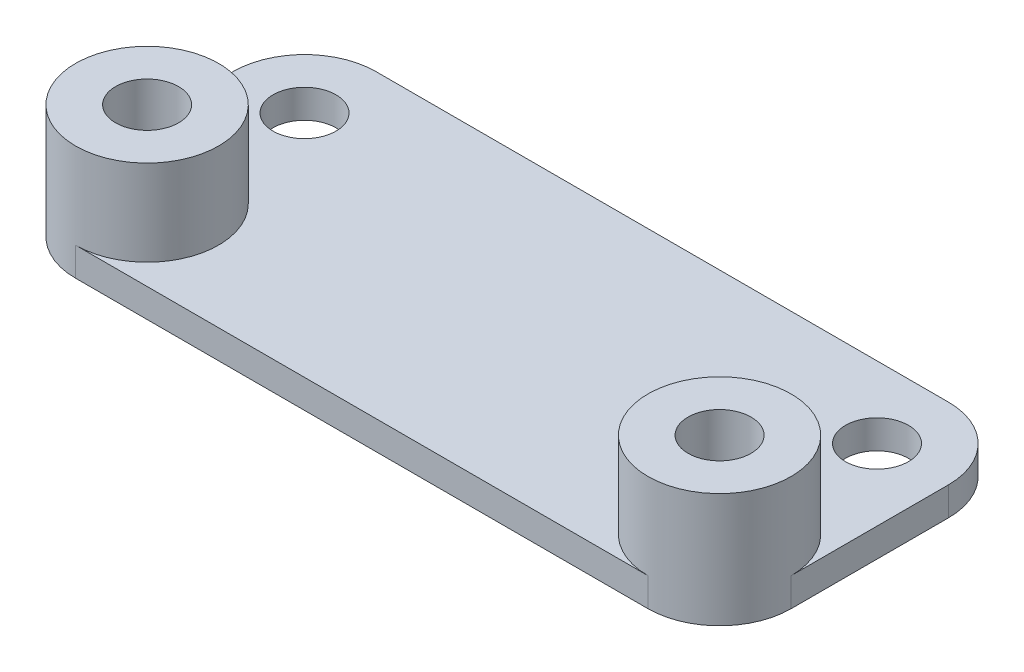
ISO-10303-21;
HEADER;
FILE_DESCRIPTION(('STEP AP214'),'2;1');
FILE_NAME('part.step','',(''),(''),'','','');
FILE_SCHEMA(('AUTOMOTIVE_DESIGN { 1 0 10303 214 1 1 1 1 }'));
ENDSEC;
DATA;
#1=APPLICATION_CONTEXT('core data for automotive mechanical design processes');
#2=APPLICATION_PROTOCOL_DEFINITION('international standard','automotive_design',2000,#1);
#3=PRODUCT_CONTEXT('',#1,'mechanical');
#4=PRODUCT('Part','Part','',(#3));
#5=PRODUCT_RELATED_PRODUCT_CATEGORY('part','',(#4));
#6=PRODUCT_DEFINITION_FORMATION('','',#4);
#7=PRODUCT_DEFINITION_CONTEXT('part definition',#1,'design');
#8=PRODUCT_DEFINITION('design','',#6,#7);
#9=PRODUCT_DEFINITION_SHAPE('','',#8);
#10=(LENGTH_UNIT() NAMED_UNIT(*) SI_UNIT(.MILLI.,.METRE.));
#11=(NAMED_UNIT(*) PLANE_ANGLE_UNIT() SI_UNIT($,.RADIAN.));
#12=(NAMED_UNIT(*) SI_UNIT($,.STERADIAN.) SOLID_ANGLE_UNIT());
#13=UNCERTAINTY_MEASURE_WITH_UNIT(LENGTH_MEASURE(1.E-05),#10,'distance_accuracy_value','');
#14=(GEOMETRIC_REPRESENTATION_CONTEXT(3) GLOBAL_UNCERTAINTY_ASSIGNED_CONTEXT((#13)) GLOBAL_UNIT_ASSIGNED_CONTEXT((#10,
#11,#12)) REPRESENTATION_CONTEXT('',''));
#15=CARTESIAN_POINT('',(0.,0.,0.));
#16=DIRECTION('',(0.,0.,1.));
#17=DIRECTION('',(1.,0.,0.));
#18=AXIS2_PLACEMENT_3D('',#15,#16,#17);
#19=CARTESIAN_POINT('',(-20.,2.,3.5));
#20=DIRECTION('',(0.,-1.,0.));
#21=DIRECTION('',(0.,0.,-1.));
#22=AXIS2_PLACEMENT_3D('',#19,#20,#21);
#23=PLANE('',#22);
#24=CARTESIAN_POINT('',(20.,2.,-7.5));
#25=DIRECTION('',(0.,1.,0.));
#26=DIRECTION('',(0.,0.,1.));
#27=AXIS2_PLACEMENT_3D('',#24,#25,#26);
#28=CIRCLE('',#27,2.2);
#29=CARTESIAN_POINT('',(20.,2.,-5.29999999999999));
#30=VERTEX_POINT('',#29);
#31=EDGE_CURVE('E147',#30,#30,#28,.T.);
#32=ORIENTED_EDGE('',*,*,#31,.F.);
#33=EDGE_LOOP('',(#32));
#34=FACE_BOUND('',#33,.T.);
#35=CARTESIAN_POINT('',(-20.,2.,-7.5));
#36=DIRECTION('',(0.,1.,0.));
#37=DIRECTION('',(0.,0.,1.));
#38=AXIS2_PLACEMENT_3D('',#35,#36,#37);
#39=CIRCLE('',#38,2.2);
#40=CARTESIAN_POINT('',(-20.,2.,-5.29999999999999));
#41=VERTEX_POINT('',#40);
#42=EDGE_CURVE('E211',#41,#41,#39,.T.);
#43=ORIENTED_EDGE('',*,*,#42,.F.);
#44=EDGE_LOOP('',(#43));
#45=FACE_BOUND('',#44,.T.);
#46=CARTESIAN_POINT('',(20.,2.,3.5));
#47=DIRECTION('',(0.,1.,0.));
#48=DIRECTION('',(0.,0.,1.));
#49=AXIS2_PLACEMENT_3D('',#46,#47,#48);
#50=CIRCLE('',#49,5.);
#51=CARTESIAN_POINT('',(25.,2.,3.5));
#52=VERTEX_POINT('',#51);
#53=CARTESIAN_POINT('',(20.,2.,8.5));
#54=VERTEX_POINT('',#53);
#55=EDGE_CURVE('E186',#52,#54,#50,.T.);
#56=ORIENTED_EDGE('',*,*,#55,.F.);
#57=DIRECTION('',(0.,0.,-1.));
#58=VECTOR('',#57,1.);
#59=CARTESIAN_POINT('',(25.,2.,-7.49999999999996));
#60=LINE('',#59,#58);
#61=CARTESIAN_POINT('',(25.,2.,-7.49999999999996));
#62=VERTEX_POINT('',#61);
#63=EDGE_CURVE('E201',#52,#62,#60,.T.);
#64=ORIENTED_EDGE('',*,*,#63,.T.);
#65=CARTESIAN_POINT('',(20.,2.,-7.5));
#66=DIRECTION('',(0.,1.,0.));
#67=DIRECTION('',(0.,0.,-1.));
#68=AXIS2_PLACEMENT_3D('',#65,#66,#67);
#69=CIRCLE('',#68,5.);
#70=CARTESIAN_POINT('',(20.,2.,-12.5));
#71=VERTEX_POINT('',#70);
#72=EDGE_CURVE('E120',#62,#71,#69,.T.);
#73=ORIENTED_EDGE('',*,*,#72,.T.);
#74=DIRECTION('',(-1.,0.,0.));
#75=VECTOR('',#74,1.);
#76=CARTESIAN_POINT('',(-20.,2.,-12.5));
#77=LINE('',#76,#75);
#78=CARTESIAN_POINT('',(-20.,2.,-12.5));
#79=VERTEX_POINT('',#78);
#80=EDGE_CURVE('E115',#71,#79,#77,.T.);
#81=ORIENTED_EDGE('',*,*,#80,.T.);
#82=CARTESIAN_POINT('',(-20.,2.,-7.5));
#83=DIRECTION('',(0.,1.,0.));
#84=DIRECTION('',(0.,0.,-1.));
#85=AXIS2_PLACEMENT_3D('',#82,#83,#84);
#86=CIRCLE('',#85,5.);
#87=CARTESIAN_POINT('',(-25.,2.,-7.49999999999996));
#88=VERTEX_POINT('',#87);
#89=EDGE_CURVE('E118',#79,#88,#86,.T.);
#90=ORIENTED_EDGE('',*,*,#89,.T.);
#91=DIRECTION('',(0.,0.,1.));
#92=VECTOR('',#91,1.);
#93=CARTESIAN_POINT('',(-25.,2.,3.49999999999997));
#94=LINE('',#93,#92);
#95=CARTESIAN_POINT('',(-25.,2.,3.49999999999997));
#96=VERTEX_POINT('',#95);
#97=EDGE_CURVE('E61',#88,#96,#94,.T.);
#98=ORIENTED_EDGE('',*,*,#97,.T.);
#99=CARTESIAN_POINT('',(-20.,2.,3.5));
#100=DIRECTION('',(0.,1.,0.));
#101=DIRECTION('',(0.,0.,1.));
#102=AXIS2_PLACEMENT_3D('',#99,#100,#101);
#103=CIRCLE('',#102,5.);
#104=CARTESIAN_POINT('',(-20.,2.,8.5));
#105=VERTEX_POINT('',#104);
#106=EDGE_CURVE('E231',#105,#96,#103,.T.);
#107=ORIENTED_EDGE('',*,*,#106,.F.);
#108=DIRECTION('',(1.,0.,0.));
#109=VECTOR('',#108,1.);
#110=CARTESIAN_POINT('',(20.,2.,8.5));
#111=LINE('',#110,#109);
#112=EDGE_CURVE('E104',#105,#54,#111,.T.);
#113=ORIENTED_EDGE('',*,*,#112,.T.);
#114=EDGE_LOOP('',(#56,#64,#73,#81,#90,#98,#107,#113));
#115=FACE_BOUND('',#114,.T.);
#116=ADVANCED_FACE('F43',(#34,#45,#115),#23,.F.);
#117=CARTESIAN_POINT('',(-20.,0.,3.5));
#118=DIRECTION('',(0.,-1.,0.));
#119=DIRECTION('',(0.,0.,-1.));
#120=AXIS2_PLACEMENT_3D('',#117,#118,#119);
#121=PLANE('',#120);
#122=CARTESIAN_POINT('',(20.,0.,3.5));
#123=DIRECTION('',(0.,1.,0.));
#124=DIRECTION('',(0.,0.,1.));
#125=AXIS2_PLACEMENT_3D('',#122,#123,#124);
#126=CIRCLE('',#125,2.2);
#127=CARTESIAN_POINT('',(20.,0.,5.70000000000001));
#128=VERTEX_POINT('',#127);
#129=EDGE_CURVE('E219',#128,#128,#126,.T.);
#130=ORIENTED_EDGE('',*,*,#129,.T.);
#131=EDGE_LOOP('',(#130));
#132=FACE_BOUND('',#131,.T.);
#133=CARTESIAN_POINT('',(20.,0.,-7.5));
#134=DIRECTION('',(0.,1.,0.));
#135=DIRECTION('',(0.,0.,1.));
#136=AXIS2_PLACEMENT_3D('',#133,#134,#135);
#137=CIRCLE('',#136,2.2);
#138=CARTESIAN_POINT('',(20.,0.,-5.29999999999999));
#139=VERTEX_POINT('',#138);
#140=EDGE_CURVE('E207',#139,#139,#137,.T.);
#141=ORIENTED_EDGE('',*,*,#140,.T.);
#142=EDGE_LOOP('',(#141));
#143=FACE_BOUND('',#142,.T.);
#144=CARTESIAN_POINT('',(-20.,0.,3.5));
#145=DIRECTION('',(0.,1.,0.));
#146=DIRECTION('',(0.,0.,-1.));
#147=AXIS2_PLACEMENT_3D('',#144,#145,#146);
#148=CIRCLE('',#147,5.);
#149=CARTESIAN_POINT('',(-25.,0.,3.49999999999997));
#150=VERTEX_POINT('',#149);
#151=CARTESIAN_POINT('',(-20.,0.,8.5));
#152=VERTEX_POINT('',#151);
#153=EDGE_CURVE('E142',#150,#152,#148,.T.);
#154=ORIENTED_EDGE('',*,*,#153,.F.);
#155=DIRECTION('',(0.,0.,1.));
#156=VECTOR('',#155,1.);
#157=CARTESIAN_POINT('',(-25.,0.,3.49999999999997));
#158=LINE('',#157,#156);
#159=CARTESIAN_POINT('',(-25.,0.,-7.49999999999996));
#160=VERTEX_POINT('',#159);
#161=EDGE_CURVE('E97',#160,#150,#158,.T.);
#162=ORIENTED_EDGE('',*,*,#161,.F.);
#163=CARTESIAN_POINT('',(-20.,0.,-7.5));
#164=DIRECTION('',(0.,1.,0.));
#165=DIRECTION('',(0.,0.,-1.));
#166=AXIS2_PLACEMENT_3D('',#163,#164,#165);
#167=CIRCLE('',#166,5.);
#168=CARTESIAN_POINT('',(-20.,0.,-12.5));
#169=VERTEX_POINT('',#168);
#170=EDGE_CURVE('E91',#169,#160,#167,.T.);
#171=ORIENTED_EDGE('',*,*,#170,.F.);
#172=DIRECTION('',(-1.,0.,0.));
#173=VECTOR('',#172,1.);
#174=CARTESIAN_POINT('',(-20.,0.,-12.5));
#175=LINE('',#174,#173);
#176=CARTESIAN_POINT('',(20.,0.,-12.5));
#177=VERTEX_POINT('',#176);
#178=EDGE_CURVE('E129',#177,#169,#175,.T.);
#179=ORIENTED_EDGE('',*,*,#178,.F.);
#180=CARTESIAN_POINT('',(20.,0.,-7.5));
#181=DIRECTION('',(0.,1.,0.));
#182=DIRECTION('',(0.,0.,-1.));
#183=AXIS2_PLACEMENT_3D('',#180,#181,#182);
#184=CIRCLE('',#183,5.);
#185=CARTESIAN_POINT('',(25.,0.,-7.49999999999996));
#186=VERTEX_POINT('',#185);
#187=EDGE_CURVE('E156',#186,#177,#184,.T.);
#188=ORIENTED_EDGE('',*,*,#187,.F.);
#189=DIRECTION('',(0.,0.,-1.));
#190=VECTOR('',#189,1.);
#191=CARTESIAN_POINT('',(25.,0.,-7.49999999999996));
#192=LINE('',#191,#190);
#193=CARTESIAN_POINT('',(25.,0.,3.49999999999997));
#194=VERTEX_POINT('',#193);
#195=EDGE_CURVE('E153',#194,#186,#192,.T.);
#196=ORIENTED_EDGE('',*,*,#195,.F.);
#197=CARTESIAN_POINT('',(20.,0.,3.5));
#198=DIRECTION('',(0.,1.,0.));
#199=DIRECTION('',(0.,0.,-1.));
#200=AXIS2_PLACEMENT_3D('',#197,#198,#199);
#201=CIRCLE('',#200,5.);
#202=CARTESIAN_POINT('',(20.,0.,8.5));
#203=VERTEX_POINT('',#202);
#204=EDGE_CURVE('E150',#203,#194,#201,.T.);
#205=ORIENTED_EDGE('',*,*,#204,.F.);
#206=DIRECTION('',(1.,0.,0.));
#207=VECTOR('',#206,1.);
#208=CARTESIAN_POINT('',(20.,0.,8.5));
#209=LINE('',#208,#207);
#210=EDGE_CURVE('E146',#152,#203,#209,.T.);
#211=ORIENTED_EDGE('',*,*,#210,.F.);
#212=EDGE_LOOP('',(#154,#162,#171,#179,#188,#196,#205,#211));
#213=FACE_BOUND('',#212,.T.);
#214=CARTESIAN_POINT('',(-20.,0.,-7.5));
#215=DIRECTION('',(0.,1.,0.));
#216=DIRECTION('',(0.,0.,1.));
#217=AXIS2_PLACEMENT_3D('',#214,#215,#216);
#218=CIRCLE('',#217,2.2);
#219=CARTESIAN_POINT('',(-20.,0.,-5.29999999999999));
#220=VERTEX_POINT('',#219);
#221=EDGE_CURVE('E215',#220,#220,#218,.T.);
#222=ORIENTED_EDGE('',*,*,#221,.T.);
#223=EDGE_LOOP('',(#222));
#224=FACE_BOUND('',#223,.T.);
#225=CARTESIAN_POINT('',(-20.,0.,3.5));
#226=DIRECTION('',(0.,1.,0.));
#227=DIRECTION('',(0.,0.,1.));
#228=AXIS2_PLACEMENT_3D('',#225,#226,#227);
#229=CIRCLE('',#228,2.2);
#230=CARTESIAN_POINT('',(-20.,0.,5.70000000000001));
#231=VERTEX_POINT('',#230);
#232=EDGE_CURVE('E226',#231,#231,#229,.T.);
#233=ORIENTED_EDGE('',*,*,#232,.T.);
#234=EDGE_LOOP('',(#233));
#235=FACE_BOUND('',#234,.T.);
#236=ADVANCED_FACE('F191',(#132,#143,#213,#224,#235),#121,.T.);
#237=CARTESIAN_POINT('',(-20.,2.,3.5));
#238=DIRECTION('',(0.,-1.,0.));
#239=DIRECTION('',(0.,0.,-1.));
#240=AXIS2_PLACEMENT_3D('',#237,#238,#239);
#241=CYLINDRICAL_SURFACE('',#240,5.);
#242=ORIENTED_EDGE('',*,*,#153,.T.);
#243=DIRECTION('',(0.,-1.,0.));
#244=VECTOR('',#243,1.);
#245=CARTESIAN_POINT('',(-20.,2.,8.5));
#246=LINE('',#245,#244);
#247=EDGE_CURVE('E11',#105,#152,#246,.T.);
#248=ORIENTED_EDGE('',*,*,#247,.F.);
#249=ORIENTED_EDGE('',*,*,#106,.T.);
#250=DIRECTION('',(0.,-1.,0.));
#251=VECTOR('',#250,1.);
#252=CARTESIAN_POINT('',(-25.,2.,3.49999999999997));
#253=LINE('',#252,#251);
#254=EDGE_CURVE('E138',#96,#150,#253,.T.);
#255=ORIENTED_EDGE('',*,*,#254,.T.);
#256=EDGE_LOOP('',(#242,#248,#249,#255));
#257=FACE_BOUND('',#256,.T.);
#258=CARTESIAN_POINT('',(-20.,8.,3.5));
#259=DIRECTION('',(0.,1.,0.));
#260=DIRECTION('',(0.,0.,1.));
#261=AXIS2_PLACEMENT_3D('',#258,#259,#260);
#262=CIRCLE('',#261,5.);
#263=CARTESIAN_POINT('',(-20.,8.,8.5));
#264=VERTEX_POINT('',#263);
#265=EDGE_CURVE('E230',#264,#264,#262,.T.);
#266=ORIENTED_EDGE('',*,*,#265,.F.);
#267=EDGE_LOOP('',(#266));
#268=FACE_BOUND('',#267,.T.);
#269=ADVANCED_FACE('F45',(#257,#268),#241,.T.);
#270=CARTESIAN_POINT('',(20.,2.,8.5));
#271=DIRECTION('',(0.,0.,-1.));
#272=DIRECTION('',(-1.,0.,0.));
#273=AXIS2_PLACEMENT_3D('',#270,#271,#272);
#274=PLANE('',#273);
#275=ORIENTED_EDGE('',*,*,#210,.T.);
#276=DIRECTION('',(0.,-1.,0.));
#277=VECTOR('',#276,1.);
#278=CARTESIAN_POINT('',(20.,2.,8.5));
#279=LINE('',#278,#277);
#280=EDGE_CURVE('E53',#54,#203,#279,.T.);
#281=ORIENTED_EDGE('',*,*,#280,.F.);
#282=ORIENTED_EDGE('',*,*,#112,.F.);
#283=ORIENTED_EDGE('',*,*,#247,.T.);
#284=EDGE_LOOP('',(#275,#281,#282,#283));
#285=FACE_BOUND('',#284,.T.);
#286=ADVANCED_FACE('F256',(#285),#274,.F.);
#287=CARTESIAN_POINT('',(20.,2.,3.5));
#288=DIRECTION('',(0.,-1.,0.));
#289=DIRECTION('',(0.,0.,-1.));
#290=AXIS2_PLACEMENT_3D('',#287,#288,#289);
#291=CYLINDRICAL_SURFACE('',#290,5.);
#292=ORIENTED_EDGE('',*,*,#204,.T.);
#293=DIRECTION('',(0.,-1.,0.));
#294=VECTOR('',#293,1.);
#295=CARTESIAN_POINT('',(25.,2.,3.49999999999997));
#296=LINE('',#295,#294);
#297=EDGE_CURVE('E175',#52,#194,#296,.T.);
#298=ORIENTED_EDGE('',*,*,#297,.F.);
#299=ORIENTED_EDGE('',*,*,#55,.T.);
#300=ORIENTED_EDGE('',*,*,#280,.T.);
#301=EDGE_LOOP('',(#292,#298,#299,#300));
#302=FACE_BOUND('',#301,.T.);
#303=CARTESIAN_POINT('',(20.,8.,3.5));
#304=DIRECTION('',(0.,1.,0.));
#305=DIRECTION('',(0.,0.,1.));
#306=AXIS2_PLACEMENT_3D('',#303,#304,#305);
#307=CIRCLE('',#306,5.);
#308=CARTESIAN_POINT('',(20.,8.,8.50000000000001));
#309=VERTEX_POINT('',#308);
#310=EDGE_CURVE('E246',#309,#309,#307,.T.);
#311=ORIENTED_EDGE('',*,*,#310,.F.);
#312=EDGE_LOOP('',(#311));
#313=FACE_BOUND('',#312,.T.);
#314=ADVANCED_FACE('F183',(#302,#313),#291,.T.);
#315=CARTESIAN_POINT('',(25.,2.,-7.49999999999996));
#316=DIRECTION('',(-1.,0.,0.));
#317=DIRECTION('',(0.,0.,1.));
#318=AXIS2_PLACEMENT_3D('',#315,#316,#317);
#319=PLANE('',#318);
#320=ORIENTED_EDGE('',*,*,#195,.T.);
#321=DIRECTION('',(0.,-1.,0.));
#322=VECTOR('',#321,1.);
#323=CARTESIAN_POINT('',(25.,2.,-7.49999999999996));
#324=LINE('',#323,#322);
#325=EDGE_CURVE('E171',#62,#186,#324,.T.);
#326=ORIENTED_EDGE('',*,*,#325,.F.);
#327=ORIENTED_EDGE('',*,*,#63,.F.);
#328=ORIENTED_EDGE('',*,*,#297,.T.);
#329=EDGE_LOOP('',(#320,#326,#327,#328));
#330=FACE_BOUND('',#329,.T.);
#331=ADVANCED_FACE('F196',(#330),#319,.F.);
#332=CARTESIAN_POINT('',(20.,2.,-7.5));
#333=DIRECTION('',(0.,-1.,0.));
#334=DIRECTION('',(0.,0.,-1.));
#335=AXIS2_PLACEMENT_3D('',#332,#333,#334);
#336=CYLINDRICAL_SURFACE('',#335,5.);
#337=ORIENTED_EDGE('',*,*,#187,.T.);
#338=DIRECTION('',(0.,-1.,0.));
#339=VECTOR('',#338,1.);
#340=CARTESIAN_POINT('',(20.,2.,-12.5));
#341=LINE('',#340,#339);
#342=EDGE_CURVE('E131',#71,#177,#341,.T.);
#343=ORIENTED_EDGE('',*,*,#342,.F.);
#344=ORIENTED_EDGE('',*,*,#72,.F.);
#345=ORIENTED_EDGE('',*,*,#325,.T.);
#346=EDGE_LOOP('',(#337,#343,#344,#345));
#347=FACE_BOUND('',#346,.T.);
#348=ADVANCED_FACE('F199',(#347),#336,.T.);
#349=CARTESIAN_POINT('',(-20.,2.,-12.5));
#350=DIRECTION('',(0.,0.,1.));
#351=DIRECTION('',(1.,0.,0.));
#352=AXIS2_PLACEMENT_3D('',#349,#350,#351);
#353=PLANE('',#352);
#354=ORIENTED_EDGE('',*,*,#178,.T.);
#355=DIRECTION('',(0.,-1.,0.));
#356=VECTOR('',#355,1.);
#357=CARTESIAN_POINT('',(-20.,2.,-12.5));
#358=LINE('',#357,#356);
#359=EDGE_CURVE('E126',#79,#169,#358,.T.);
#360=ORIENTED_EDGE('',*,*,#359,.F.);
#361=ORIENTED_EDGE('',*,*,#80,.F.);
#362=ORIENTED_EDGE('',*,*,#342,.T.);
#363=EDGE_LOOP('',(#354,#360,#361,#362));
#364=FACE_BOUND('',#363,.T.);
#365=ADVANCED_FACE('F127',(#364),#353,.F.);
#366=CARTESIAN_POINT('',(-20.,2.,-7.5));
#367=DIRECTION('',(0.,-1.,0.));
#368=DIRECTION('',(0.,0.,-1.));
#369=AXIS2_PLACEMENT_3D('',#366,#367,#368);
#370=CYLINDRICAL_SURFACE('',#369,5.);
#371=ORIENTED_EDGE('',*,*,#170,.T.);
#372=DIRECTION('',(0.,-1.,0.));
#373=VECTOR('',#372,1.);
#374=CARTESIAN_POINT('',(-25.,2.,-7.49999999999996));
#375=LINE('',#374,#373);
#376=EDGE_CURVE('E132',#88,#160,#375,.T.);
#377=ORIENTED_EDGE('',*,*,#376,.F.);
#378=ORIENTED_EDGE('',*,*,#89,.F.);
#379=ORIENTED_EDGE('',*,*,#359,.T.);
#380=EDGE_LOOP('',(#371,#377,#378,#379));
#381=FACE_BOUND('',#380,.T.);
#382=ADVANCED_FACE('F134',(#381),#370,.T.);
#383=CARTESIAN_POINT('',(-25.,2.,3.49999999999997));
#384=DIRECTION('',(1.,0.,0.));
#385=DIRECTION('',(0.,0.,-1.));
#386=AXIS2_PLACEMENT_3D('',#383,#384,#385);
#387=PLANE('',#386);
#388=ORIENTED_EDGE('',*,*,#161,.T.);
#389=ORIENTED_EDGE('',*,*,#254,.F.);
#390=ORIENTED_EDGE('',*,*,#97,.F.);
#391=ORIENTED_EDGE('',*,*,#376,.T.);
#392=EDGE_LOOP('',(#388,#389,#390,#391));
#393=FACE_BOUND('',#392,.T.);
#394=ADVANCED_FACE('F277',(#393),#387,.F.);
#395=CARTESIAN_POINT('',(20.,2.,-7.5));
#396=DIRECTION('',(0.,-1.,0.));
#397=DIRECTION('',(0.,0.,-1.));
#398=AXIS2_PLACEMENT_3D('',#395,#396,#397);
#399=CYLINDRICAL_SURFACE('',#398,2.2);
#400=ORIENTED_EDGE('',*,*,#31,.T.);
#401=EDGE_LOOP('',(#400));
#402=FACE_BOUND('',#401,.T.);
#403=ORIENTED_EDGE('',*,*,#140,.F.);
#404=EDGE_LOOP('',(#403));
#405=FACE_BOUND('',#404,.T.);
#406=ADVANCED_FACE('F274',(#402,#405),#399,.F.);
#407=CARTESIAN_POINT('',(-20.,2.,-7.5));
#408=DIRECTION('',(0.,-1.,0.));
#409=DIRECTION('',(0.,0.,-1.));
#410=AXIS2_PLACEMENT_3D('',#407,#408,#409);
#411=CYLINDRICAL_SURFACE('',#410,2.2);
#412=ORIENTED_EDGE('',*,*,#42,.T.);
#413=EDGE_LOOP('',(#412));
#414=FACE_BOUND('',#413,.T.);
#415=ORIENTED_EDGE('',*,*,#221,.F.);
#416=EDGE_LOOP('',(#415));
#417=FACE_BOUND('',#416,.T.);
#418=ADVANCED_FACE('F308',(#414,#417),#411,.F.);
#419=CARTESIAN_POINT('',(20.,2.,3.5));
#420=DIRECTION('',(0.,-1.,0.));
#421=DIRECTION('',(0.,0.,-1.));
#422=AXIS2_PLACEMENT_3D('',#419,#420,#421);
#423=CYLINDRICAL_SURFACE('',#422,2.2);
#424=ORIENTED_EDGE('',*,*,#129,.F.);
#425=EDGE_LOOP('',(#424));
#426=FACE_BOUND('',#425,.T.);
#427=CARTESIAN_POINT('',(20.,8.,3.5));
#428=DIRECTION('',(0.,1.,0.));
#429=DIRECTION('',(0.,0.,1.));
#430=AXIS2_PLACEMENT_3D('',#427,#428,#429);
#431=CIRCLE('',#430,2.2);
#432=CARTESIAN_POINT('',(20.,8.,5.70000000000001));
#433=VERTEX_POINT('',#432);
#434=EDGE_CURVE('E242',#433,#433,#431,.T.);
#435=ORIENTED_EDGE('',*,*,#434,.T.);
#436=EDGE_LOOP('',(#435));
#437=FACE_BOUND('',#436,.T.);
#438=ADVANCED_FACE('F315',(#426,#437),#423,.F.);
#439=CARTESIAN_POINT('',(-20.,2.,3.5));
#440=DIRECTION('',(0.,-1.,0.));
#441=DIRECTION('',(0.,0.,-1.));
#442=AXIS2_PLACEMENT_3D('',#439,#440,#441);
#443=CYLINDRICAL_SURFACE('',#442,2.2);
#444=ORIENTED_EDGE('',*,*,#232,.F.);
#445=EDGE_LOOP('',(#444));
#446=FACE_BOUND('',#445,.T.);
#447=CARTESIAN_POINT('',(-20.,8.,3.5));
#448=DIRECTION('',(0.,1.,0.));
#449=DIRECTION('',(0.,0.,1.));
#450=AXIS2_PLACEMENT_3D('',#447,#448,#449);
#451=CIRCLE('',#450,2.2);
#452=CARTESIAN_POINT('',(-20.,8.,5.70000000000001));
#453=VERTEX_POINT('',#452);
#454=EDGE_CURVE('E235',#453,#453,#451,.T.);
#455=ORIENTED_EDGE('',*,*,#454,.T.);
#456=EDGE_LOOP('',(#455));
#457=FACE_BOUND('',#456,.T.);
#458=ADVANCED_FACE('F321',(#446,#457),#443,.F.);
#459=CARTESIAN_POINT('',(-20.,8.,3.5));
#460=DIRECTION('',(0.,1.,0.));
#461=DIRECTION('',(0.,0.,1.));
#462=AXIS2_PLACEMENT_3D('',#459,#460,#461);
#463=PLANE('',#462);
#464=ORIENTED_EDGE('',*,*,#265,.T.);
#465=EDGE_LOOP('',(#464));
#466=FACE_BOUND('',#465,.T.);
#467=ORIENTED_EDGE('',*,*,#454,.F.);
#468=EDGE_LOOP('',(#467));
#469=FACE_BOUND('',#468,.T.);
#470=ADVANCED_FACE('F329',(#466,#469),#463,.T.);
#471=CARTESIAN_POINT('',(20.,8.,3.5));
#472=DIRECTION('',(0.,1.,0.));
#473=DIRECTION('',(0.,0.,1.));
#474=AXIS2_PLACEMENT_3D('',#471,#472,#473);
#475=PLANE('',#474);
#476=ORIENTED_EDGE('',*,*,#310,.T.);
#477=EDGE_LOOP('',(#476));
#478=FACE_BOUND('',#477,.T.);
#479=ORIENTED_EDGE('',*,*,#434,.F.);
#480=EDGE_LOOP('',(#479));
#481=FACE_BOUND('',#480,.T.);
#482=ADVANCED_FACE('F253',(#478,#481),#475,.T.);
#483=CLOSED_SHELL('',(#116,#236,#269,#286,#314,#331,#348,#365,#382,#394,#406,#418,#438,#458,
#470,#482));
#484=MANIFOLD_SOLID_BREP('B2',#483);
#485=ADVANCED_BREP_SHAPE_REPRESENTATION('',(#18,#484),#14);
#486=SHAPE_DEFINITION_REPRESENTATION(#9,#485);
ENDSEC;
END-ISO-10303-21;
